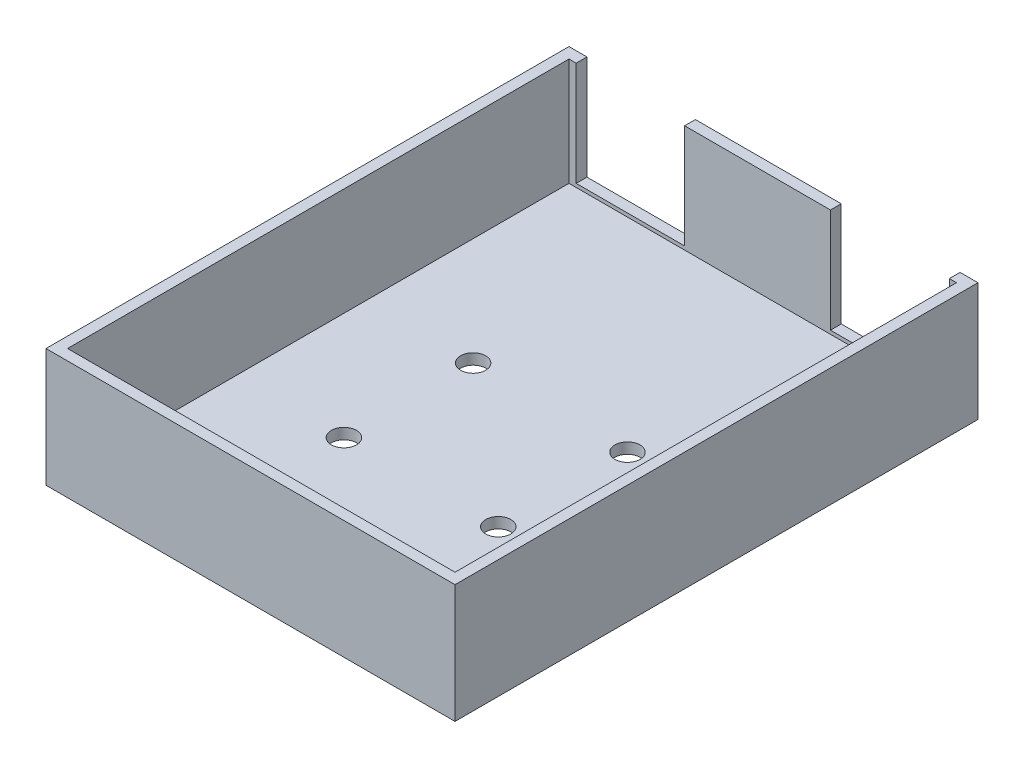
ISO-10303-21;
HEADER;
FILE_DESCRIPTION(('STEP AP214'),'2;1');
FILE_NAME('part.step','',(''),(''),'','','');
FILE_SCHEMA(('AUTOMOTIVE_DESIGN { 1 0 10303 214 1 1 1 1 }'));
ENDSEC;
DATA;
#1=APPLICATION_CONTEXT('core data for automotive mechanical design processes');
#2=APPLICATION_PROTOCOL_DEFINITION('international standard','automotive_design',2000,#1);
#3=PRODUCT_CONTEXT('',#1,'mechanical');
#4=PRODUCT('Part','Part','',(#3));
#5=PRODUCT_RELATED_PRODUCT_CATEGORY('part','',(#4));
#6=PRODUCT_DEFINITION_FORMATION('','',#4);
#7=PRODUCT_DEFINITION_CONTEXT('part definition',#1,'design');
#8=PRODUCT_DEFINITION('design','',#6,#7);
#9=PRODUCT_DEFINITION_SHAPE('','',#8);
#10=(LENGTH_UNIT() NAMED_UNIT(*) SI_UNIT(.MILLI.,.METRE.));
#11=(NAMED_UNIT(*) PLANE_ANGLE_UNIT() SI_UNIT($,.RADIAN.));
#12=(NAMED_UNIT(*) SI_UNIT($,.STERADIAN.) SOLID_ANGLE_UNIT());
#13=UNCERTAINTY_MEASURE_WITH_UNIT(LENGTH_MEASURE(1.E-05),#10,'distance_accuracy_value','');
#14=(GEOMETRIC_REPRESENTATION_CONTEXT(3) GLOBAL_UNCERTAINTY_ASSIGNED_CONTEXT((#13)) GLOBAL_UNIT_ASSIGNED_CONTEXT((#10,
#11,#12)) REPRESENTATION_CONTEXT('',''));
#15=CARTESIAN_POINT('',(0.,0.,0.));
#16=DIRECTION('',(0.,0.,1.));
#17=DIRECTION('',(1.,0.,0.));
#18=AXIS2_PLACEMENT_3D('',#15,#16,#17);
#19=CARTESIAN_POINT('',(0.,16.5,0.));
#20=DIRECTION('',(0.,1.,0.));
#21=DIRECTION('',(0.,0.,1.));
#22=AXIS2_PLACEMENT_3D('',#19,#20,#21);
#23=PLANE('',#22);
#24=DIRECTION('',(-1.,0.,0.));
#25=VECTOR('',#24,1.);
#26=CARTESIAN_POINT('',(-19.6956621004566,16.5,-22.28350456621));
#27=LINE('',#26,#25);
#28=CARTESIAN_POINT('',(16.7293378995434,16.5,-22.28350456621));
#29=VERTEX_POINT('',#28);
#30=CARTESIAN_POINT('',(-3.59066210045661,16.5,-22.28350456621));
#31=VERTEX_POINT('',#30);
#32=EDGE_CURVE('E171',#29,#31,#27,.T.);
#33=ORIENTED_EDGE('',*,*,#32,.F.);
#34=DIRECTION('',(0.,0.,-1.));
#35=VECTOR('',#34,1.);
#36=CARTESIAN_POINT('',(16.7293378995434,16.5,49.06749543379));
#37=LINE('',#36,#35);
#38=CARTESIAN_POINT('',(16.7293378995434,16.5,-23.78350456621));
#39=VERTEX_POINT('',#38);
#40=EDGE_CURVE('E164',#29,#39,#37,.T.);
#41=ORIENTED_EDGE('',*,*,#40,.T.);
#42=DIRECTION('',(-1.,0.,0.));
#43=VECTOR('',#42,1.);
#44=CARTESIAN_POINT('',(-21.1956621004566,16.5,-23.78350456621));
#45=LINE('',#44,#43);
#46=CARTESIAN_POINT('',(-3.59066210045661,16.5,-23.78350456621));
#47=VERTEX_POINT('',#46);
#48=EDGE_CURVE('E316',#39,#47,#45,.T.);
#49=ORIENTED_EDGE('',*,*,#48,.T.);
#50=DIRECTION('',(0.,0.,-1.));
#51=VECTOR('',#50,1.);
#52=CARTESIAN_POINT('',(-3.59066210045661,16.5,49.06749543379));
#53=LINE('',#52,#51);
#54=EDGE_CURVE('E192',#31,#47,#53,.T.);
#55=ORIENTED_EDGE('',*,*,#54,.F.);
#56=EDGE_LOOP('',(#33,#41,#49,#55));
#57=FACE_BOUND('',#56,.T.);
#58=ADVANCED_FACE('F33',(#57),#23,.T.);
#59=DIRECTION('',(0.,0.,-1.));
#60=VECTOR('',#59,1.);
#61=CARTESIAN_POINT('',(33.2793378995434,16.5,49.06749543379));
#62=LINE('',#61,#60);
#63=CARTESIAN_POINT('',(33.2793378995434,16.5,-22.28350456621));
#64=VERTEX_POINT('',#63);
#65=CARTESIAN_POINT('',(33.2793378995434,16.5,-23.78350456621));
#66=VERTEX_POINT('',#65);
#67=EDGE_CURVE('E147',#64,#66,#62,.T.);
#68=ORIENTED_EDGE('',*,*,#67,.F.);
#69=CARTESIAN_POINT('',(34.2793378995434,16.5,-22.28350456621));
#70=VERTEX_POINT('',#69);
#71=EDGE_CURVE('E160',#70,#64,#27,.T.);
#72=ORIENTED_EDGE('',*,*,#71,.F.);
#73=DIRECTION('',(0.,0.,-1.));
#74=VECTOR('',#73,1.);
#75=CARTESIAN_POINT('',(34.2793378995434,16.5,-22.28350456621));
#76=LINE('',#75,#74);
#77=CARTESIAN_POINT('',(34.2793378995434,16.5,47.5664954337899));
#78=VERTEX_POINT('',#77);
#79=EDGE_CURVE('E178',#78,#70,#76,.T.);
#80=ORIENTED_EDGE('',*,*,#79,.F.);
#81=DIRECTION('',(1.,0.,0.));
#82=VECTOR('',#81,1.);
#83=CARTESIAN_POINT('',(-19.6956621004566,16.5,47.5664954337899));
#84=LINE('',#83,#82);
#85=CARTESIAN_POINT('',(-19.6956621004566,16.5,47.5664954337899));
#86=VERTEX_POINT('',#85);
#87=EDGE_CURVE('E182',#86,#78,#84,.T.);
#88=ORIENTED_EDGE('',*,*,#87,.F.);
#89=DIRECTION('',(0.,0.,1.));
#90=VECTOR('',#89,1.);
#91=CARTESIAN_POINT('',(-19.6956621004566,16.5,-22.28350456621));
#92=LINE('',#91,#90);
#93=CARTESIAN_POINT('',(-19.6956621004566,16.5,-22.28350456621));
#94=VERTEX_POINT('',#93);
#95=EDGE_CURVE('E185',#94,#86,#92,.T.);
#96=ORIENTED_EDGE('',*,*,#95,.F.);
#97=CARTESIAN_POINT('',(-18.6956621004566,16.5,-22.28350456621));
#98=VERTEX_POINT('',#97);
#99=EDGE_CURVE('E173',#98,#94,#27,.T.);
#100=ORIENTED_EDGE('',*,*,#99,.F.);
#101=DIRECTION('',(0.,0.,-1.));
#102=VECTOR('',#101,1.);
#103=CARTESIAN_POINT('',(-18.6956621004566,16.5,49.06749543379));
#104=LINE('',#103,#102);
#105=CARTESIAN_POINT('',(-18.6956621004566,16.5,-23.78350456621));
#106=VERTEX_POINT('',#105);
#107=EDGE_CURVE('E197',#98,#106,#104,.T.);
#108=ORIENTED_EDGE('',*,*,#107,.T.);
#109=CARTESIAN_POINT('',(-21.1956621004566,16.5,-23.78350456621));
#110=VERTEX_POINT('',#109);
#111=EDGE_CURVE('E313',#106,#110,#45,.T.);
#112=ORIENTED_EDGE('',*,*,#111,.T.);
#113=DIRECTION('',(0.,0.,1.));
#114=VECTOR('',#113,1.);
#115=CARTESIAN_POINT('',(-21.1956621004566,16.5,-23.78350456621));
#116=LINE('',#115,#114);
#117=CARTESIAN_POINT('',(-21.1956621004566,16.5,49.06649543379));
#118=VERTEX_POINT('',#117);
#119=EDGE_CURVE('E284',#110,#118,#116,.T.);
#120=ORIENTED_EDGE('',*,*,#119,.T.);
#121=DIRECTION('',(1.,0.,0.));
#122=VECTOR('',#121,1.);
#123=CARTESIAN_POINT('',(-21.1956621004566,16.5,49.06649543379));
#124=LINE('',#123,#122);
#125=CARTESIAN_POINT('',(35.7793378995434,16.5,49.06649543379));
#126=VERTEX_POINT('',#125);
#127=EDGE_CURVE('E311',#118,#126,#124,.T.);
#128=ORIENTED_EDGE('',*,*,#127,.T.);
#129=DIRECTION('',(0.,0.,-1.));
#130=VECTOR('',#129,1.);
#131=CARTESIAN_POINT('',(35.7793378995434,16.5,-23.78350456621));
#132=LINE('',#131,#130);
#133=CARTESIAN_POINT('',(35.7793378995434,16.5,-23.78350456621));
#134=VERTEX_POINT('',#133);
#135=EDGE_CURVE('E312',#126,#134,#132,.T.);
#136=ORIENTED_EDGE('',*,*,#135,.T.);
#137=EDGE_CURVE('E162',#134,#66,#45,.T.);
#138=ORIENTED_EDGE('',*,*,#137,.T.);
#139=EDGE_LOOP('',(#68,#72,#80,#88,#96,#100,#108,#112,#120,#128,#136,#138));
#140=FACE_BOUND('',#139,.T.);
#141=ADVANCED_FACE('F158',(#140),#23,.T.);
#142=CARTESIAN_POINT('',(-21.1956621004566,16.5,-23.78350456621));
#143=DIRECTION('',(0.,0.,1.));
#144=DIRECTION('',(1.,0.,0.));
#145=AXIS2_PLACEMENT_3D('',#142,#143,#144);
#146=PLANE('',#145);
#147=DIRECTION('',(0.,-1.,0.));
#148=VECTOR('',#147,1.);
#149=CARTESIAN_POINT('',(16.7293378995434,0.,-23.78350456621));
#150=LINE('',#149,#148);
#151=CARTESIAN_POINT('',(16.7293378995434,2.,-23.78350456621));
#152=VERTEX_POINT('',#151);
#153=EDGE_CURVE('E217',#39,#152,#150,.T.);
#154=ORIENTED_EDGE('',*,*,#153,.T.);
#155=DIRECTION('',(-1.,0.,0.));
#156=VECTOR('',#155,1.);
#157=CARTESIAN_POINT('',(0.,2.,-23.78350456621));
#158=LINE('',#157,#156);
#159=CARTESIAN_POINT('',(33.2793378995434,2.,-23.78350456621));
#160=VERTEX_POINT('',#159);
#161=EDGE_CURVE('E223',#160,#152,#158,.T.);
#162=ORIENTED_EDGE('',*,*,#161,.F.);
#163=DIRECTION('',(0.,-1.,0.));
#164=VECTOR('',#163,1.);
#165=CARTESIAN_POINT('',(33.2793378995434,0.,-23.78350456621));
#166=LINE('',#165,#164);
#167=EDGE_CURVE('E152',#66,#160,#166,.T.);
#168=ORIENTED_EDGE('',*,*,#167,.F.);
#169=ORIENTED_EDGE('',*,*,#137,.F.);
#170=DIRECTION('',(0.,-1.,0.));
#171=VECTOR('',#170,1.);
#172=CARTESIAN_POINT('',(35.7793378995434,16.5,-23.78350456621));
#173=LINE('',#172,#171);
#174=CARTESIAN_POINT('',(35.7793378995434,0.,-23.78350456621));
#175=VERTEX_POINT('',#174);
#176=EDGE_CURVE('E287',#134,#175,#173,.T.);
#177=ORIENTED_EDGE('',*,*,#176,.T.);
#178=DIRECTION('',(-1.,0.,0.));
#179=VECTOR('',#178,1.);
#180=CARTESIAN_POINT('',(-21.1956621004566,0.,-23.78350456621));
#181=LINE('',#180,#179);
#182=CARTESIAN_POINT('',(-21.1956621004566,0.,-23.78350456621));
#183=VERTEX_POINT('',#182);
#184=EDGE_CURVE('E266',#175,#183,#181,.T.);
#185=ORIENTED_EDGE('',*,*,#184,.T.);
#186=DIRECTION('',(0.,-1.,0.));
#187=VECTOR('',#186,1.);
#188=CARTESIAN_POINT('',(-21.1956621004566,16.5,-23.78350456621));
#189=LINE('',#188,#187);
#190=EDGE_CURVE('E285',#110,#183,#189,.T.);
#191=ORIENTED_EDGE('',*,*,#190,.F.);
#192=ORIENTED_EDGE('',*,*,#111,.F.);
#193=DIRECTION('',(0.,-1.,0.));
#194=VECTOR('',#193,1.);
#195=CARTESIAN_POINT('',(-18.6956621004566,0.,-23.78350456621));
#196=LINE('',#195,#194);
#197=CARTESIAN_POINT('',(-18.6956621004566,2.,-23.78350456621));
#198=VERTEX_POINT('',#197);
#199=EDGE_CURVE('E195',#106,#198,#196,.T.);
#200=ORIENTED_EDGE('',*,*,#199,.T.);
#201=DIRECTION('',(-1.,0.,0.));
#202=VECTOR('',#201,1.);
#203=CARTESIAN_POINT('',(0.,2.,-23.78350456621));
#204=LINE('',#203,#202);
#205=CARTESIAN_POINT('',(-3.59066210045661,2.,-23.78350456621));
#206=VERTEX_POINT('',#205);
#207=EDGE_CURVE('E203',#206,#198,#204,.T.);
#208=ORIENTED_EDGE('',*,*,#207,.F.);
#209=DIRECTION('',(0.,-1.,0.));
#210=VECTOR('',#209,1.);
#211=CARTESIAN_POINT('',(-3.59066210045661,0.,-23.78350456621));
#212=LINE('',#211,#210);
#213=EDGE_CURVE('E206',#47,#206,#212,.T.);
#214=ORIENTED_EDGE('',*,*,#213,.F.);
#215=ORIENTED_EDGE('',*,*,#48,.F.);
#216=EDGE_LOOP('',(#154,#162,#168,#169,#177,#185,#191,#192,#200,#208,#214,#215));
#217=FACE_BOUND('',#216,.T.);
#218=ADVANCED_FACE('F326',(#217),#146,.F.);
#219=CARTESIAN_POINT('',(-19.6956621004566,16.5,-22.28350456621));
#220=DIRECTION('',(0.,0.,1.));
#221=DIRECTION('',(1.,0.,0.));
#222=AXIS2_PLACEMENT_3D('',#219,#220,#221);
#223=PLANE('',#222);
#224=DIRECTION('',(-1.,0.,0.));
#225=VECTOR('',#224,1.);
#226=CARTESIAN_POINT('',(0.,2.,-22.28350456621));
#227=LINE('',#226,#225);
#228=CARTESIAN_POINT('',(33.2793378995434,2.,-22.28350456621));
#229=VERTEX_POINT('',#228);
#230=CARTESIAN_POINT('',(16.7293378995434,2.,-22.28350456621));
#231=VERTEX_POINT('',#230);
#232=EDGE_CURVE('E163',#229,#231,#227,.T.);
#233=ORIENTED_EDGE('',*,*,#232,.T.);
#234=DIRECTION('',(0.,-1.,0.));
#235=VECTOR('',#234,1.);
#236=CARTESIAN_POINT('',(16.7293378995434,0.,-22.28350456621));
#237=LINE('',#236,#235);
#238=EDGE_CURVE('E153',#29,#231,#237,.T.);
#239=ORIENTED_EDGE('',*,*,#238,.F.);
#240=ORIENTED_EDGE('',*,*,#32,.T.);
#241=DIRECTION('',(0.,-1.,0.));
#242=VECTOR('',#241,1.);
#243=CARTESIAN_POINT('',(-3.59066210045661,0.,-22.28350456621));
#244=LINE('',#243,#242);
#245=CARTESIAN_POINT('',(-3.59066210045661,2.,-22.28350456621));
#246=VERTEX_POINT('',#245);
#247=EDGE_CURVE('E208',#31,#246,#244,.T.);
#248=ORIENTED_EDGE('',*,*,#247,.T.);
#249=DIRECTION('',(-1.,0.,0.));
#250=VECTOR('',#249,1.);
#251=CARTESIAN_POINT('',(0.,2.,-22.28350456621));
#252=LINE('',#251,#250);
#253=CARTESIAN_POINT('',(-18.6956621004566,2.,-22.28350456621));
#254=VERTEX_POINT('',#253);
#255=EDGE_CURVE('E189',#246,#254,#252,.T.);
#256=ORIENTED_EDGE('',*,*,#255,.T.);
#257=DIRECTION('',(0.,-1.,0.));
#258=VECTOR('',#257,1.);
#259=CARTESIAN_POINT('',(-18.6956621004566,0.,-22.28350456621));
#260=LINE('',#259,#258);
#261=EDGE_CURVE('E211',#98,#254,#260,.T.);
#262=ORIENTED_EDGE('',*,*,#261,.F.);
#263=ORIENTED_EDGE('',*,*,#99,.T.);
#264=DIRECTION('',(0.,-1.,0.));
#265=VECTOR('',#264,1.);
#266=CARTESIAN_POINT('',(-19.6956621004566,16.5,-22.28350456621));
#267=LINE('',#266,#265);
#268=CARTESIAN_POINT('',(-19.6956621004566,1.5,-22.28350456621));
#269=VERTEX_POINT('',#268);
#270=EDGE_CURVE('E170',#94,#269,#267,.T.);
#271=ORIENTED_EDGE('',*,*,#270,.T.);
#272=DIRECTION('',(1.,0.,0.));
#273=VECTOR('',#272,1.);
#274=CARTESIAN_POINT('',(-19.6956621004566,1.5,-22.28350456621));
#275=LINE('',#274,#273);
#276=CARTESIAN_POINT('',(34.2793378995434,1.5,-22.28350456621));
#277=VERTEX_POINT('',#276);
#278=EDGE_CURVE('E11',#269,#277,#275,.T.);
#279=ORIENTED_EDGE('',*,*,#278,.T.);
#280=DIRECTION('',(0.,-1.,0.));
#281=VECTOR('',#280,1.);
#282=CARTESIAN_POINT('',(34.2793378995434,16.5,-22.28350456621));
#283=LINE('',#282,#281);
#284=EDGE_CURVE('E168',#70,#277,#283,.T.);
#285=ORIENTED_EDGE('',*,*,#284,.F.);
#286=ORIENTED_EDGE('',*,*,#71,.T.);
#287=DIRECTION('',(0.,-1.,0.));
#288=VECTOR('',#287,1.);
#289=CARTESIAN_POINT('',(33.2793378995434,0.,-22.28350456621));
#290=LINE('',#289,#288);
#291=EDGE_CURVE('E144',#64,#229,#290,.T.);
#292=ORIENTED_EDGE('',*,*,#291,.T.);
#293=EDGE_LOOP('',(#233,#239,#240,#248,#256,#262,#263,#271,#279,#285,#286,#292));
#294=FACE_BOUND('',#293,.T.);
#295=ADVANCED_FACE('F166',(#294),#223,.T.);
#296=CARTESIAN_POINT('',(0.,1.5,0.));
#297=DIRECTION('',(0.,1.,0.));
#298=DIRECTION('',(0.,0.,1.));
#299=AXIS2_PLACEMENT_3D('',#296,#297,#298);
#300=PLANE('',#299);
#301=CARTESIAN_POINT('',(-4.6956621004566,1.5,24.0664954337899));
#302=DIRECTION('',(0.,1.,0.));
#303=DIRECTION('',(0.,0.,1.));
#304=AXIS2_PLACEMENT_3D('',#301,#302,#303);
#305=CIRCLE('',#304,1.75);
#306=CARTESIAN_POINT('',(-4.6956621004566,1.5,25.8164954337899));
#307=VERTEX_POINT('',#306);
#308=EDGE_CURVE('E241',#307,#307,#305,.F.);
#309=ORIENTED_EDGE('',*,*,#308,.T.);
#310=EDGE_LOOP('',(#309));
#311=FACE_BOUND('',#310,.T.);
#312=CARTESIAN_POINT('',(16.8043378995434,1.5,6.06649543378996));
#313=DIRECTION('',(0.,1.,0.));
#314=DIRECTION('',(0.,0.,1.));
#315=AXIS2_PLACEMENT_3D('',#312,#313,#314);
#316=CIRCLE('',#315,1.75);
#317=CARTESIAN_POINT('',(16.8043378995434,1.5,7.81649543378996));
#318=VERTEX_POINT('',#317);
#319=EDGE_CURVE('E234',#318,#318,#316,.F.);
#320=ORIENTED_EDGE('',*,*,#319,.T.);
#321=EDGE_LOOP('',(#320));
#322=FACE_BOUND('',#321,.T.);
#323=CARTESIAN_POINT('',(-4.6956621004566,1.5,6.06649543378995));
#324=DIRECTION('',(0.,1.,0.));
#325=DIRECTION('',(0.,0.,1.));
#326=AXIS2_PLACEMENT_3D('',#323,#324,#325);
#327=CIRCLE('',#326,1.75);
#328=CARTESIAN_POINT('',(-4.6956621004566,1.5,7.81649543378995));
#329=VERTEX_POINT('',#328);
#330=EDGE_CURVE('E246',#329,#329,#327,.F.);
#331=ORIENTED_EDGE('',*,*,#330,.T.);
#332=EDGE_LOOP('',(#331));
#333=FACE_BOUND('',#332,.T.);
#334=CARTESIAN_POINT('',(16.8043378995434,1.5,24.06649543379));
#335=DIRECTION('',(0.,1.,0.));
#336=DIRECTION('',(0.,0.,1.));
#337=AXIS2_PLACEMENT_3D('',#334,#335,#336);
#338=CIRCLE('',#337,1.75);
#339=CARTESIAN_POINT('',(16.8043378995434,1.5,25.81649543379));
#340=VERTEX_POINT('',#339);
#341=EDGE_CURVE('E228',#340,#340,#338,.F.);
#342=ORIENTED_EDGE('',*,*,#341,.T.);
#343=EDGE_LOOP('',(#342));
#344=FACE_BOUND('',#343,.T.);
#345=DIRECTION('',(0.,0.,1.));
#346=VECTOR('',#345,1.);
#347=CARTESIAN_POINT('',(-19.6956621004566,1.5,-22.28350456621));
#348=LINE('',#347,#346);
#349=CARTESIAN_POINT('',(-19.6956621004566,1.5,47.5664954337899));
#350=VERTEX_POINT('',#349);
#351=EDGE_CURVE('E295',#269,#350,#348,.T.);
#352=ORIENTED_EDGE('',*,*,#351,.T.);
#353=DIRECTION('',(1.,0.,0.));
#354=VECTOR('',#353,1.);
#355=CARTESIAN_POINT('',(-19.6956621004566,1.5,47.5664954337899));
#356=LINE('',#355,#354);
#357=CARTESIAN_POINT('',(34.2793378995434,1.5,47.5664954337899));
#358=VERTEX_POINT('',#357);
#359=EDGE_CURVE('E297',#350,#358,#356,.T.);
#360=ORIENTED_EDGE('',*,*,#359,.T.);
#361=DIRECTION('',(0.,0.,1.));
#362=VECTOR('',#361,1.);
#363=CARTESIAN_POINT('',(34.2793378995434,1.5,-22.28350456621));
#364=LINE('',#363,#362);
#365=EDGE_CURVE('E41',#277,#358,#364,.T.);
#366=ORIENTED_EDGE('',*,*,#365,.F.);
#367=ORIENTED_EDGE('',*,*,#278,.F.);
#368=EDGE_LOOP('',(#352,#360,#366,#367));
#369=FACE_BOUND('',#368,.T.);
#370=ADVANCED_FACE('F350',(#311,#322,#333,#344,#369),#300,.T.);
#371=CARTESIAN_POINT('',(-21.1956621004566,16.5,-23.78350456621));
#372=DIRECTION('',(1.,0.,0.));
#373=DIRECTION('',(0.,0.,-1.));
#374=AXIS2_PLACEMENT_3D('',#371,#372,#373);
#375=PLANE('',#374);
#376=DIRECTION('',(0.,0.,1.));
#377=VECTOR('',#376,1.);
#378=CARTESIAN_POINT('',(-21.1956621004566,0.,-23.78350456621));
#379=LINE('',#378,#377);
#380=CARTESIAN_POINT('',(-21.1956621004566,0.,49.06649543379));
#381=VERTEX_POINT('',#380);
#382=EDGE_CURVE('E264',#183,#381,#379,.T.);
#383=ORIENTED_EDGE('',*,*,#382,.T.);
#384=DIRECTION('',(0.,-1.,0.));
#385=VECTOR('',#384,1.);
#386=CARTESIAN_POINT('',(-21.1956621004566,16.5,49.06649543379));
#387=LINE('',#386,#385);
#388=EDGE_CURVE('E293',#118,#381,#387,.T.);
#389=ORIENTED_EDGE('',*,*,#388,.F.);
#390=ORIENTED_EDGE('',*,*,#119,.F.);
#391=ORIENTED_EDGE('',*,*,#190,.T.);
#392=EDGE_LOOP('',(#383,#389,#390,#391));
#393=FACE_BOUND('',#392,.T.);
#394=ADVANCED_FACE('F342',(#393),#375,.F.);
#395=CARTESIAN_POINT('',(-21.1956621004566,16.5,49.06649543379));
#396=DIRECTION('',(0.,0.,-1.));
#397=DIRECTION('',(-1.,0.,0.));
#398=AXIS2_PLACEMENT_3D('',#395,#396,#397);
#399=PLANE('',#398);
#400=DIRECTION('',(1.,0.,0.));
#401=VECTOR('',#400,1.);
#402=CARTESIAN_POINT('',(-21.1956621004566,0.,49.06649543379));
#403=LINE('',#402,#401);
#404=CARTESIAN_POINT('',(35.7793378995434,0.,49.06649543379));
#405=VERTEX_POINT('',#404);
#406=EDGE_CURVE('E267',#381,#405,#403,.T.);
#407=ORIENTED_EDGE('',*,*,#406,.T.);
#408=DIRECTION('',(0.,-1.,0.));
#409=VECTOR('',#408,1.);
#410=CARTESIAN_POINT('',(35.7793378995434,16.5,49.06649543379));
#411=LINE('',#410,#409);
#412=EDGE_CURVE('E290',#126,#405,#411,.T.);
#413=ORIENTED_EDGE('',*,*,#412,.F.);
#414=ORIENTED_EDGE('',*,*,#127,.F.);
#415=ORIENTED_EDGE('',*,*,#388,.T.);
#416=EDGE_LOOP('',(#407,#413,#414,#415));
#417=FACE_BOUND('',#416,.T.);
#418=ADVANCED_FACE('F340',(#417),#399,.F.);
#419=CARTESIAN_POINT('',(35.7793378995434,16.5,-23.78350456621));
#420=DIRECTION('',(-1.,0.,0.));
#421=DIRECTION('',(0.,0.,1.));
#422=AXIS2_PLACEMENT_3D('',#419,#420,#421);
#423=PLANE('',#422);
#424=DIRECTION('',(0.,0.,-1.));
#425=VECTOR('',#424,1.);
#426=CARTESIAN_POINT('',(35.7793378995434,0.,-23.78350456621));
#427=LINE('',#426,#425);
#428=EDGE_CURVE('E274',#405,#175,#427,.T.);
#429=ORIENTED_EDGE('',*,*,#428,.T.);
#430=ORIENTED_EDGE('',*,*,#176,.F.);
#431=ORIENTED_EDGE('',*,*,#135,.F.);
#432=ORIENTED_EDGE('',*,*,#412,.T.);
#433=EDGE_LOOP('',(#429,#430,#431,#432));
#434=FACE_BOUND('',#433,.T.);
#435=ADVANCED_FACE('F337',(#434),#423,.F.);
#436=CARTESIAN_POINT('',(-19.6956621004566,16.5,-22.28350456621));
#437=DIRECTION('',(1.,0.,0.));
#438=DIRECTION('',(0.,0.,-1.));
#439=AXIS2_PLACEMENT_3D('',#436,#437,#438);
#440=PLANE('',#439);
#441=DIRECTION('',(0.,-1.,0.));
#442=VECTOR('',#441,1.);
#443=CARTESIAN_POINT('',(-19.6956621004566,16.5,47.5664954337899));
#444=LINE('',#443,#442);
#445=EDGE_CURVE('E272',#86,#350,#444,.T.);
#446=ORIENTED_EDGE('',*,*,#445,.T.);
#447=ORIENTED_EDGE('',*,*,#351,.F.);
#448=ORIENTED_EDGE('',*,*,#270,.F.);
#449=ORIENTED_EDGE('',*,*,#95,.T.);
#450=EDGE_LOOP('',(#446,#447,#448,#449));
#451=FACE_BOUND('',#450,.T.);
#452=ADVANCED_FACE('F348',(#451),#440,.T.);
#453=CARTESIAN_POINT('',(-19.6956621004566,16.5,47.5664954337899));
#454=DIRECTION('',(0.,0.,-1.));
#455=DIRECTION('',(-1.,0.,0.));
#456=AXIS2_PLACEMENT_3D('',#453,#454,#455);
#457=PLANE('',#456);
#458=DIRECTION('',(0.,-1.,0.));
#459=VECTOR('',#458,1.);
#460=CARTESIAN_POINT('',(34.2793378995434,16.5,47.5664954337899));
#461=LINE('',#460,#459);
#462=EDGE_CURVE('E277',#78,#358,#461,.T.);
#463=ORIENTED_EDGE('',*,*,#462,.T.);
#464=ORIENTED_EDGE('',*,*,#359,.F.);
#465=ORIENTED_EDGE('',*,*,#445,.F.);
#466=ORIENTED_EDGE('',*,*,#87,.T.);
#467=EDGE_LOOP('',(#463,#464,#465,#466));
#468=FACE_BOUND('',#467,.T.);
#469=ADVANCED_FACE('F303',(#468),#457,.T.);
#470=CARTESIAN_POINT('',(34.2793378995434,16.5,-22.28350456621));
#471=DIRECTION('',(-1.,0.,0.));
#472=DIRECTION('',(0.,0.,1.));
#473=AXIS2_PLACEMENT_3D('',#470,#471,#472);
#474=PLANE('',#473);
#475=ORIENTED_EDGE('',*,*,#284,.T.);
#476=ORIENTED_EDGE('',*,*,#365,.T.);
#477=ORIENTED_EDGE('',*,*,#462,.F.);
#478=ORIENTED_EDGE('',*,*,#79,.T.);
#479=EDGE_LOOP('',(#475,#476,#477,#478));
#480=FACE_BOUND('',#479,.T.);
#481=ADVANCED_FACE('F257',(#480),#474,.T.);
#482=CARTESIAN_POINT('',(0.,0.,0.));
#483=DIRECTION('',(0.,1.,0.));
#484=DIRECTION('',(0.,0.,1.));
#485=AXIS2_PLACEMENT_3D('',#482,#483,#484);
#486=PLANE('',#485);
#487=CARTESIAN_POINT('',(-4.6956621004566,0.,24.0664954337899));
#488=DIRECTION('',(0.,-1.,0.));
#489=DIRECTION('',(0.,0.,-1.));
#490=AXIS2_PLACEMENT_3D('',#487,#488,#489);
#491=CIRCLE('',#490,1.75);
#492=CARTESIAN_POINT('',(-4.6956621004566,0.,22.3164954337899));
#493=VERTEX_POINT('',#492);
#494=EDGE_CURVE('E231',#493,#493,#491,.T.);
#495=ORIENTED_EDGE('',*,*,#494,.F.);
#496=EDGE_LOOP('',(#495));
#497=FACE_BOUND('',#496,.T.);
#498=CARTESIAN_POINT('',(16.8043378995434,0.,6.06649543378996));
#499=DIRECTION('',(0.,-1.,0.));
#500=DIRECTION('',(0.,0.,-1.));
#501=AXIS2_PLACEMENT_3D('',#498,#499,#500);
#502=CIRCLE('',#501,1.75);
#503=CARTESIAN_POINT('',(16.8043378995434,0.,4.31649543378996));
#504=VERTEX_POINT('',#503);
#505=EDGE_CURVE('E237',#504,#504,#502,.T.);
#506=ORIENTED_EDGE('',*,*,#505,.F.);
#507=EDGE_LOOP('',(#506));
#508=FACE_BOUND('',#507,.T.);
#509=CARTESIAN_POINT('',(-4.6956621004566,0.,6.06649543378995));
#510=DIRECTION('',(0.,-1.,0.));
#511=DIRECTION('',(0.,0.,-1.));
#512=AXIS2_PLACEMENT_3D('',#509,#510,#511);
#513=CIRCLE('',#512,1.75);
#514=CARTESIAN_POINT('',(-4.6956621004566,0.,4.31649543378995));
#515=VERTEX_POINT('',#514);
#516=EDGE_CURVE('E238',#515,#515,#513,.T.);
#517=ORIENTED_EDGE('',*,*,#516,.F.);
#518=EDGE_LOOP('',(#517));
#519=FACE_BOUND('',#518,.T.);
#520=CARTESIAN_POINT('',(16.8043378995434,0.,24.06649543379));
#521=DIRECTION('',(0.,-1.,0.));
#522=DIRECTION('',(0.,0.,-1.));
#523=AXIS2_PLACEMENT_3D('',#520,#521,#522);
#524=CIRCLE('',#523,1.75);
#525=CARTESIAN_POINT('',(16.8043378995434,0.,22.31649543379));
#526=VERTEX_POINT('',#525);
#527=EDGE_CURVE('E213',#526,#526,#524,.T.);
#528=ORIENTED_EDGE('',*,*,#527,.F.);
#529=EDGE_LOOP('',(#528));
#530=FACE_BOUND('',#529,.T.);
#531=ORIENTED_EDGE('',*,*,#382,.F.);
#532=ORIENTED_EDGE('',*,*,#184,.F.);
#533=ORIENTED_EDGE('',*,*,#428,.F.);
#534=ORIENTED_EDGE('',*,*,#406,.F.);
#535=EDGE_LOOP('',(#531,#532,#533,#534));
#536=FACE_BOUND('',#535,.T.);
#537=ADVANCED_FACE('F35',(#497,#508,#519,#530,#536),#486,.F.);
#538=CARTESIAN_POINT('',(0.,2.,49.06749543379));
#539=DIRECTION('',(0.,-1.,0.));
#540=DIRECTION('',(0.,0.,-1.));
#541=AXIS2_PLACEMENT_3D('',#538,#539,#540);
#542=PLANE('',#541);
#543=DIRECTION('',(0.,0.,-1.));
#544=VECTOR('',#543,1.);
#545=CARTESIAN_POINT('',(-3.59066210045661,2.,49.06749543379));
#546=LINE('',#545,#544);
#547=EDGE_CURVE('E56',#246,#206,#546,.T.);
#548=ORIENTED_EDGE('',*,*,#547,.T.);
#549=ORIENTED_EDGE('',*,*,#207,.T.);
#550=DIRECTION('',(0.,0.,-1.));
#551=VECTOR('',#550,1.);
#552=CARTESIAN_POINT('',(-18.6956621004566,2.,49.06749543379));
#553=LINE('',#552,#551);
#554=EDGE_CURVE('E194',#254,#198,#553,.T.);
#555=ORIENTED_EDGE('',*,*,#554,.F.);
#556=ORIENTED_EDGE('',*,*,#255,.F.);
#557=EDGE_LOOP('',(#548,#549,#555,#556));
#558=FACE_BOUND('',#557,.T.);
#559=ADVANCED_FACE('F256',(#558),#542,.F.);
#560=CARTESIAN_POINT('',(-18.6956621004566,0.,49.06749543379));
#561=DIRECTION('',(1.,0.,0.));
#562=DIRECTION('',(0.,1.,0.));
#563=AXIS2_PLACEMENT_3D('',#560,#561,#562);
#564=PLANE('',#563);
#565=ORIENTED_EDGE('',*,*,#261,.T.);
#566=ORIENTED_EDGE('',*,*,#554,.T.);
#567=ORIENTED_EDGE('',*,*,#199,.F.);
#568=ORIENTED_EDGE('',*,*,#107,.F.);
#569=EDGE_LOOP('',(#565,#566,#567,#568));
#570=FACE_BOUND('',#569,.T.);
#571=ADVANCED_FACE('F344',(#570),#564,.T.);
#572=CARTESIAN_POINT('',(-3.59066210045661,0.,49.06749543379));
#573=DIRECTION('',(1.,0.,0.));
#574=DIRECTION('',(0.,0.,-1.));
#575=AXIS2_PLACEMENT_3D('',#572,#573,#574);
#576=PLANE('',#575);
#577=ORIENTED_EDGE('',*,*,#54,.T.);
#578=ORIENTED_EDGE('',*,*,#213,.T.);
#579=ORIENTED_EDGE('',*,*,#547,.F.);
#580=ORIENTED_EDGE('',*,*,#247,.F.);
#581=EDGE_LOOP('',(#577,#578,#579,#580));
#582=FACE_BOUND('',#581,.T.);
#583=ADVANCED_FACE('F329',(#582),#576,.F.);
#584=CARTESIAN_POINT('',(0.,2.,49.06749543379));
#585=DIRECTION('',(0.,-1.,0.));
#586=DIRECTION('',(0.,0.,-1.));
#587=AXIS2_PLACEMENT_3D('',#584,#585,#586);
#588=PLANE('',#587);
#589=DIRECTION('',(0.,0.,-1.));
#590=VECTOR('',#589,1.);
#591=CARTESIAN_POINT('',(33.2793378995434,2.,49.06749543379));
#592=LINE('',#591,#590);
#593=EDGE_CURVE('E48',#229,#160,#592,.T.);
#594=ORIENTED_EDGE('',*,*,#593,.T.);
#595=ORIENTED_EDGE('',*,*,#161,.T.);
#596=DIRECTION('',(0.,0.,-1.));
#597=VECTOR('',#596,1.);
#598=CARTESIAN_POINT('',(16.7293378995434,2.,49.06749543379));
#599=LINE('',#598,#597);
#600=EDGE_CURVE('E216',#231,#152,#599,.T.);
#601=ORIENTED_EDGE('',*,*,#600,.F.);
#602=ORIENTED_EDGE('',*,*,#232,.F.);
#603=EDGE_LOOP('',(#594,#595,#601,#602));
#604=FACE_BOUND('',#603,.T.);
#605=ADVANCED_FACE('F335',(#604),#588,.F.);
#606=CARTESIAN_POINT('',(16.7293378995434,0.,49.06749543379));
#607=DIRECTION('',(1.,0.,0.));
#608=DIRECTION('',(0.,1.,0.));
#609=AXIS2_PLACEMENT_3D('',#606,#607,#608);
#610=PLANE('',#609);
#611=ORIENTED_EDGE('',*,*,#238,.T.);
#612=ORIENTED_EDGE('',*,*,#600,.T.);
#613=ORIENTED_EDGE('',*,*,#153,.F.);
#614=ORIENTED_EDGE('',*,*,#40,.F.);
#615=EDGE_LOOP('',(#611,#612,#613,#614));
#616=FACE_BOUND('',#615,.T.);
#617=ADVANCED_FACE('F333',(#616),#610,.T.);
#618=CARTESIAN_POINT('',(33.2793378995434,0.,49.06749543379));
#619=DIRECTION('',(1.,0.,0.));
#620=DIRECTION('',(0.,0.,-1.));
#621=AXIS2_PLACEMENT_3D('',#618,#619,#620);
#622=PLANE('',#621);
#623=ORIENTED_EDGE('',*,*,#67,.T.);
#624=ORIENTED_EDGE('',*,*,#167,.T.);
#625=ORIENTED_EDGE('',*,*,#593,.F.);
#626=ORIENTED_EDGE('',*,*,#291,.F.);
#627=EDGE_LOOP('',(#623,#624,#625,#626));
#628=FACE_BOUND('',#627,.T.);
#629=ADVANCED_FACE('F146',(#628),#622,.F.);
#630=CARTESIAN_POINT('',(16.8043378995434,16.501,24.06649543379));
#631=DIRECTION('',(0.,-1.,0.));
#632=DIRECTION('',(0.,0.,-1.));
#633=AXIS2_PLACEMENT_3D('',#630,#631,#632);
#634=CYLINDRICAL_SURFACE('',#633,1.75);
#635=ORIENTED_EDGE('',*,*,#341,.F.);
#636=EDGE_LOOP('',(#635));
#637=FACE_BOUND('',#636,.T.);
#638=ORIENTED_EDGE('',*,*,#527,.T.);
#639=EDGE_LOOP('',(#638));
#640=FACE_BOUND('',#639,.T.);
#641=ADVANCED_FACE('F444',(#637,#640),#634,.F.);
#642=CARTESIAN_POINT('',(-4.6956621004566,16.501,6.06649543378995));
#643=DIRECTION('',(0.,-1.,0.));
#644=DIRECTION('',(0.,0.,-1.));
#645=AXIS2_PLACEMENT_3D('',#642,#643,#644);
#646=CYLINDRICAL_SURFACE('',#645,1.75);
#647=ORIENTED_EDGE('',*,*,#330,.F.);
#648=EDGE_LOOP('',(#647));
#649=FACE_BOUND('',#648,.T.);
#650=ORIENTED_EDGE('',*,*,#516,.T.);
#651=EDGE_LOOP('',(#650));
#652=FACE_BOUND('',#651,.T.);
#653=ADVANCED_FACE('F252',(#649,#652),#646,.F.);
#654=CARTESIAN_POINT('',(16.8043378995434,16.501,6.06649543378996));
#655=DIRECTION('',(0.,-1.,0.));
#656=DIRECTION('',(0.,0.,-1.));
#657=AXIS2_PLACEMENT_3D('',#654,#655,#656);
#658=CYLINDRICAL_SURFACE('',#657,1.75);
#659=ORIENTED_EDGE('',*,*,#319,.F.);
#660=EDGE_LOOP('',(#659));
#661=FACE_BOUND('',#660,.T.);
#662=ORIENTED_EDGE('',*,*,#505,.T.);
#663=EDGE_LOOP('',(#662));
#664=FACE_BOUND('',#663,.T.);
#665=ADVANCED_FACE('F457',(#661,#664),#658,.F.);
#666=CARTESIAN_POINT('',(-4.6956621004566,16.501,24.0664954337899));
#667=DIRECTION('',(0.,-1.,0.));
#668=DIRECTION('',(0.,0.,-1.));
#669=AXIS2_PLACEMENT_3D('',#666,#667,#668);
#670=CYLINDRICAL_SURFACE('',#669,1.75);
#671=ORIENTED_EDGE('',*,*,#308,.F.);
#672=EDGE_LOOP('',(#671));
#673=FACE_BOUND('',#672,.T.);
#674=ORIENTED_EDGE('',*,*,#494,.T.);
#675=EDGE_LOOP('',(#674));
#676=FACE_BOUND('',#675,.T.);
#677=ADVANCED_FACE('F465',(#673,#676),#670,.F.);
#678=CLOSED_SHELL('',(#58,#141,#218,#295,#370,#394,#418,#435,#452,#469,#481,#537,#559,#571,#583,
#605,#617,#629,#641,#653,#665,#677));
#679=MANIFOLD_SOLID_BREP('B2',#678);
#680=ADVANCED_BREP_SHAPE_REPRESENTATION('',(#18,#679),#14);
#681=SHAPE_DEFINITION_REPRESENTATION(#9,#680);
ENDSEC;
END-ISO-10303-21;
